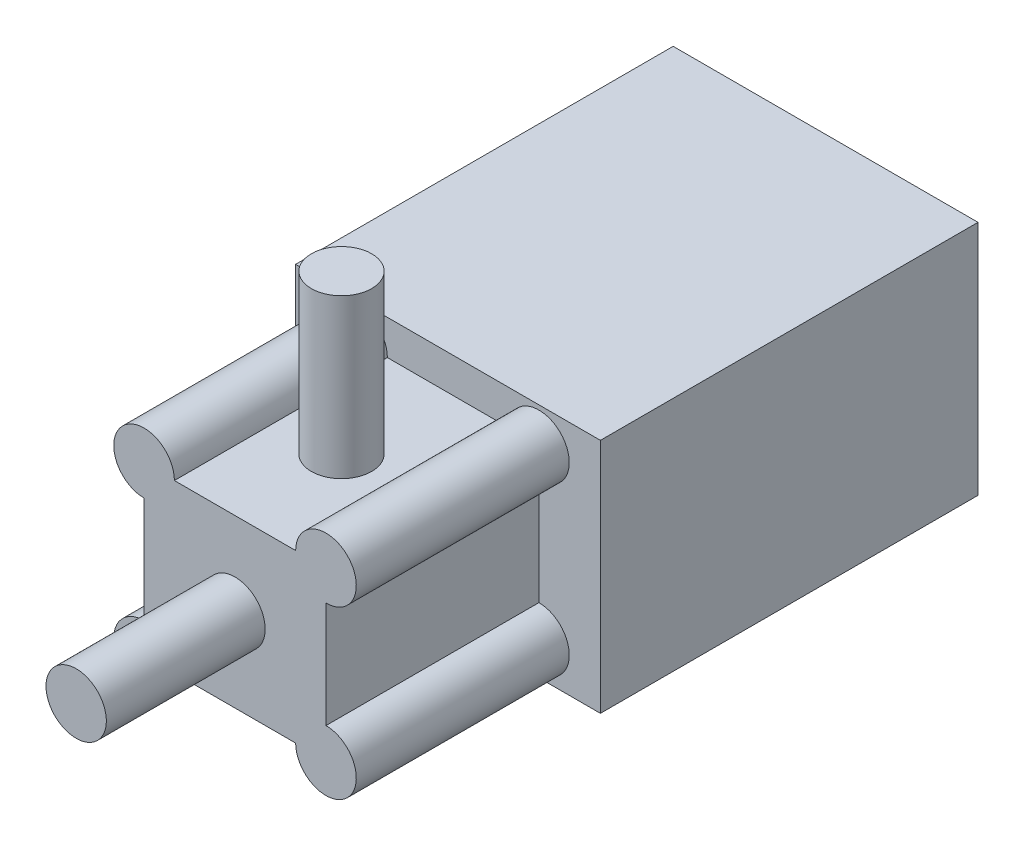
ISO-10303-21;
HEADER;
FILE_DESCRIPTION(('STEP AP214'),'2;1');
FILE_NAME('part.step','',(''),(''),'','','');
FILE_SCHEMA(('AUTOMOTIVE_DESIGN { 1 0 10303 214 1 1 1 1 }'));
ENDSEC;
DATA;
#1=APPLICATION_CONTEXT('core data for automotive mechanical design processes');
#2=APPLICATION_PROTOCOL_DEFINITION('international standard','automotive_design',2000,#1);
#3=PRODUCT_CONTEXT('',#1,'mechanical');
#4=PRODUCT('Part','Part','',(#3));
#5=PRODUCT_RELATED_PRODUCT_CATEGORY('part','',(#4));
#6=PRODUCT_DEFINITION_FORMATION('','',#4);
#7=PRODUCT_DEFINITION_CONTEXT('part definition',#1,'design');
#8=PRODUCT_DEFINITION('design','',#6,#7);
#9=PRODUCT_DEFINITION_SHAPE('','',#8);
#10=(LENGTH_UNIT() NAMED_UNIT(*) SI_UNIT(.MILLI.,.METRE.));
#11=(NAMED_UNIT(*) PLANE_ANGLE_UNIT() SI_UNIT($,.RADIAN.));
#12=(NAMED_UNIT(*) SI_UNIT($,.STERADIAN.) SOLID_ANGLE_UNIT());
#13=UNCERTAINTY_MEASURE_WITH_UNIT(LENGTH_MEASURE(1.E-05),#10,'distance_accuracy_value','');
#14=(GEOMETRIC_REPRESENTATION_CONTEXT(3) GLOBAL_UNCERTAINTY_ASSIGNED_CONTEXT((#13)) GLOBAL_UNIT_ASSIGNED_CONTEXT((#10,
#11,#12)) REPRESENTATION_CONTEXT('',''));
#15=CARTESIAN_POINT('',(0.,0.,0.));
#16=DIRECTION('',(0.,0.,1.));
#17=DIRECTION('',(1.,0.,0.));
#18=AXIS2_PLACEMENT_3D('',#15,#16,#17);
#19=CARTESIAN_POINT('',(-10.055,-7.8,24.91));
#20=DIRECTION('',(1.,0.,0.));
#21=DIRECTION('',(0.,0.,-1.));
#22=AXIS2_PLACEMENT_3D('',#19,#20,#21);
#23=PLANE('',#22);
#24=DIRECTION('',(0.,-1.,0.));
#25=VECTOR('',#24,1.);
#26=CARTESIAN_POINT('',(-10.055,-7.8,0.));
#27=LINE('',#26,#25);
#28=CARTESIAN_POINT('',(-10.055,7.8,0.));
#29=VERTEX_POINT('',#28);
#30=CARTESIAN_POINT('',(-10.055,-7.8,0.));
#31=VERTEX_POINT('',#30);
#32=EDGE_CURVE('E145',#29,#31,#27,.T.);
#33=ORIENTED_EDGE('',*,*,#32,.T.);
#34=DIRECTION('',(0.,0.,-1.));
#35=VECTOR('',#34,1.);
#36=CARTESIAN_POINT('',(-10.055,-7.8,24.91));
#37=LINE('',#36,#35);
#38=CARTESIAN_POINT('',(-10.055,-7.8,24.91));
#39=VERTEX_POINT('',#38);
#40=EDGE_CURVE('E44',#39,#31,#37,.T.);
#41=ORIENTED_EDGE('',*,*,#40,.F.);
#42=DIRECTION('',(0.,-1.,0.));
#43=VECTOR('',#42,1.);
#44=CARTESIAN_POINT('',(-10.055,-7.8,24.91));
#45=LINE('',#44,#43);
#46=CARTESIAN_POINT('',(-10.055,7.8,24.91));
#47=VERTEX_POINT('',#46);
#48=EDGE_CURVE('E154',#47,#39,#45,.T.);
#49=ORIENTED_EDGE('',*,*,#48,.F.);
#50=DIRECTION('',(0.,0.,-1.));
#51=VECTOR('',#50,1.);
#52=CARTESIAN_POINT('',(-10.055,7.8,24.91));
#53=LINE('',#52,#51);
#54=EDGE_CURVE('E163',#47,#29,#53,.T.);
#55=ORIENTED_EDGE('',*,*,#54,.T.);
#56=EDGE_LOOP('',(#33,#41,#49,#55));
#57=FACE_BOUND('',#56,.T.);
#58=ADVANCED_FACE('F37',(#57),#23,.F.);
#59=CARTESIAN_POINT('',(10.055,-7.8,24.91));
#60=DIRECTION('',(0.,1.,0.));
#61=DIRECTION('',(-1.,0.,0.));
#62=AXIS2_PLACEMENT_3D('',#59,#60,#61);
#63=PLANE('',#62);
#64=DIRECTION('',(1.,0.,0.));
#65=VECTOR('',#64,1.);
#66=CARTESIAN_POINT('',(10.055,-7.8,0.));
#67=LINE('',#66,#65);
#68=CARTESIAN_POINT('',(10.055,-7.8,0.));
#69=VERTEX_POINT('',#68);
#70=EDGE_CURVE('E148',#31,#69,#67,.T.);
#71=ORIENTED_EDGE('',*,*,#70,.T.);
#72=DIRECTION('',(0.,0.,-1.));
#73=VECTOR('',#72,1.);
#74=CARTESIAN_POINT('',(10.055,-7.8,24.91));
#75=LINE('',#74,#73);
#76=CARTESIAN_POINT('',(10.055,-7.8,24.91));
#77=VERTEX_POINT('',#76);
#78=EDGE_CURVE('E174',#77,#69,#75,.T.);
#79=ORIENTED_EDGE('',*,*,#78,.F.);
#80=DIRECTION('',(1.,0.,0.));
#81=VECTOR('',#80,1.);
#82=CARTESIAN_POINT('',(10.055,-7.8,24.91));
#83=LINE('',#82,#81);
#84=EDGE_CURVE('E157',#39,#77,#83,.T.);
#85=ORIENTED_EDGE('',*,*,#84,.F.);
#86=ORIENTED_EDGE('',*,*,#40,.T.);
#87=EDGE_LOOP('',(#71,#79,#85,#86));
#88=FACE_BOUND('',#87,.T.);
#89=ADVANCED_FACE('F179',(#88),#63,.F.);
#90=CARTESIAN_POINT('',(10.055,-7.8,24.91));
#91=DIRECTION('',(-1.,0.,0.));
#92=DIRECTION('',(0.,-1.,0.));
#93=AXIS2_PLACEMENT_3D('',#90,#91,#92);
#94=PLANE('',#93);
#95=DIRECTION('',(0.,1.,0.));
#96=VECTOR('',#95,1.);
#97=CARTESIAN_POINT('',(10.055,-7.8,0.));
#98=LINE('',#97,#96);
#99=CARTESIAN_POINT('',(10.055,7.8,0.));
#100=VERTEX_POINT('',#99);
#101=EDGE_CURVE('E166',#69,#100,#98,.T.);
#102=ORIENTED_EDGE('',*,*,#101,.T.);
#103=DIRECTION('',(0.,0.,-1.));
#104=VECTOR('',#103,1.);
#105=CARTESIAN_POINT('',(10.055,7.8,24.91));
#106=LINE('',#105,#104);
#107=CARTESIAN_POINT('',(10.055,7.8,24.91));
#108=VERTEX_POINT('',#107);
#109=EDGE_CURVE('E171',#108,#100,#106,.T.);
#110=ORIENTED_EDGE('',*,*,#109,.F.);
#111=DIRECTION('',(0.,1.,0.));
#112=VECTOR('',#111,1.);
#113=CARTESIAN_POINT('',(10.055,-7.8,24.91));
#114=LINE('',#113,#112);
#115=EDGE_CURVE('E160',#77,#108,#114,.T.);
#116=ORIENTED_EDGE('',*,*,#115,.F.);
#117=ORIENTED_EDGE('',*,*,#78,.T.);
#118=EDGE_LOOP('',(#102,#110,#116,#117));
#119=FACE_BOUND('',#118,.T.);
#120=ADVANCED_FACE('F191',(#119),#94,.F.);
#121=CARTESIAN_POINT('',(10.055,7.8,24.91));
#122=DIRECTION('',(0.,-1.,0.));
#123=DIRECTION('',(1.,0.,0.));
#124=AXIS2_PLACEMENT_3D('',#121,#122,#123);
#125=PLANE('',#124);
#126=DIRECTION('',(-1.,0.,0.));
#127=VECTOR('',#126,1.);
#128=CARTESIAN_POINT('',(10.055,7.8,0.));
#129=LINE('',#128,#127);
#130=EDGE_CURVE('E158',#100,#29,#129,.T.);
#131=ORIENTED_EDGE('',*,*,#130,.T.);
#132=ORIENTED_EDGE('',*,*,#54,.F.);
#133=DIRECTION('',(-1.,0.,0.));
#134=VECTOR('',#133,1.);
#135=CARTESIAN_POINT('',(10.055,7.8,24.91));
#136=LINE('',#135,#134);
#137=EDGE_CURVE('E162',#108,#47,#136,.T.);
#138=ORIENTED_EDGE('',*,*,#137,.F.);
#139=ORIENTED_EDGE('',*,*,#109,.T.);
#140=EDGE_LOOP('',(#131,#132,#138,#139));
#141=FACE_BOUND('',#140,.T.);
#142=ADVANCED_FACE('F195',(#141),#125,.F.);
#143=CARTESIAN_POINT('',(0.,0.,24.91));
#144=DIRECTION('',(0.,0.,1.));
#145=DIRECTION('',(1.,0.,0.));
#146=AXIS2_PLACEMENT_3D('',#143,#144,#145);
#147=PLANE('',#146);
#148=CARTESIAN_POINT('',(6.,-5.5,24.91));
#149=DIRECTION('',(0.,0.,1.));
#150=DIRECTION('',(1.,0.,0.));
#151=AXIS2_PLACEMENT_3D('',#148,#149,#150);
#152=CIRCLE('',#151,2.);
#153=CARTESIAN_POINT('',(4.,-5.5,24.91));
#154=VERTEX_POINT('',#153);
#155=CARTESIAN_POINT('',(6.,-3.5,24.91));
#156=VERTEX_POINT('',#155);
#157=EDGE_CURVE('E51',#154,#156,#152,.T.);
#158=ORIENTED_EDGE('',*,*,#157,.F.);
#159=DIRECTION('',(-1.,0.,0.));
#160=VECTOR('',#159,1.);
#161=CARTESIAN_POINT('',(0.,-5.5,24.91));
#162=LINE('',#161,#160);
#163=CARTESIAN_POINT('',(-4.,-5.5,24.91));
#164=VERTEX_POINT('',#163);
#165=EDGE_CURVE('E56',#154,#164,#162,.T.);
#166=ORIENTED_EDGE('',*,*,#165,.T.);
#167=CARTESIAN_POINT('',(-6.,-5.5,24.91));
#168=DIRECTION('',(0.,0.,1.));
#169=DIRECTION('',(1.,0.,0.));
#170=AXIS2_PLACEMENT_3D('',#167,#168,#169);
#171=CIRCLE('',#170,2.);
#172=CARTESIAN_POINT('',(-6.,-3.5,24.91));
#173=VERTEX_POINT('',#172);
#174=EDGE_CURVE('E398',#173,#164,#171,.T.);
#175=ORIENTED_EDGE('',*,*,#174,.F.);
#176=DIRECTION('',(0.,1.,0.));
#177=VECTOR('',#176,1.);
#178=CARTESIAN_POINT('',(-6.,0.,24.91));
#179=LINE('',#178,#177);
#180=CARTESIAN_POINT('',(-6.,3.5,24.91));
#181=VERTEX_POINT('',#180);
#182=EDGE_CURVE('E396',#173,#181,#179,.T.);
#183=ORIENTED_EDGE('',*,*,#182,.T.);
#184=CARTESIAN_POINT('',(-6.,5.5,24.91));
#185=DIRECTION('',(0.,0.,1.));
#186=DIRECTION('',(1.,0.,0.));
#187=AXIS2_PLACEMENT_3D('',#184,#185,#186);
#188=CIRCLE('',#187,2.);
#189=CARTESIAN_POINT('',(-4.,5.5,24.91));
#190=VERTEX_POINT('',#189);
#191=EDGE_CURVE('E393',#190,#181,#188,.T.);
#192=ORIENTED_EDGE('',*,*,#191,.F.);
#193=DIRECTION('',(-1.,0.,0.));
#194=VECTOR('',#193,1.);
#195=CARTESIAN_POINT('',(0.,5.5,24.91));
#196=LINE('',#195,#194);
#197=CARTESIAN_POINT('',(4.,5.5,24.91));
#198=VERTEX_POINT('',#197);
#199=EDGE_CURVE('E390',#198,#190,#196,.T.);
#200=ORIENTED_EDGE('',*,*,#199,.F.);
#201=CARTESIAN_POINT('',(6.,5.5,24.91));
#202=DIRECTION('',(0.,0.,1.));
#203=DIRECTION('',(1.,0.,0.));
#204=AXIS2_PLACEMENT_3D('',#201,#202,#203);
#205=CIRCLE('',#204,2.);
#206=CARTESIAN_POINT('',(6.,3.5,24.91));
#207=VERTEX_POINT('',#206);
#208=EDGE_CURVE('E387',#207,#198,#205,.T.);
#209=ORIENTED_EDGE('',*,*,#208,.F.);
#210=DIRECTION('',(0.,1.,0.));
#211=VECTOR('',#210,1.);
#212=CARTESIAN_POINT('',(6.,0.,24.91));
#213=LINE('',#212,#211);
#214=EDGE_CURVE('E385',#156,#207,#213,.T.);
#215=ORIENTED_EDGE('',*,*,#214,.F.);
#216=EDGE_LOOP('',(#158,#166,#175,#183,#192,#200,#209,#215));
#217=FACE_BOUND('',#216,.T.);
#218=ORIENTED_EDGE('',*,*,#48,.T.);
#219=ORIENTED_EDGE('',*,*,#84,.T.);
#220=ORIENTED_EDGE('',*,*,#115,.T.);
#221=ORIENTED_EDGE('',*,*,#137,.T.);
#222=EDGE_LOOP('',(#218,#219,#220,#221));
#223=FACE_BOUND('',#222,.T.);
#224=ADVANCED_FACE('F197',(#217,#223),#147,.T.);
#225=CARTESIAN_POINT('',(0.,0.,0.));
#226=DIRECTION('',(0.,0.,1.));
#227=DIRECTION('',(1.,0.,0.));
#228=AXIS2_PLACEMENT_3D('',#225,#226,#227);
#229=PLANE('',#228);
#230=ORIENTED_EDGE('',*,*,#32,.F.);
#231=ORIENTED_EDGE('',*,*,#130,.F.);
#232=ORIENTED_EDGE('',*,*,#101,.F.);
#233=ORIENTED_EDGE('',*,*,#70,.F.);
#234=EDGE_LOOP('',(#230,#231,#232,#233));
#235=FACE_BOUND('',#234,.T.);
#236=ADVANCED_FACE('F187',(#235),#229,.F.);
#237=CARTESIAN_POINT('',(6.,-5.5,38.96));
#238=DIRECTION('',(0.,0.,-1.));
#239=DIRECTION('',(-1.,0.,0.));
#240=AXIS2_PLACEMENT_3D('',#237,#238,#239);
#241=CYLINDRICAL_SURFACE('',#240,2.);
#242=ORIENTED_EDGE('',*,*,#157,.T.);
#243=DIRECTION('',(0.,0.,-1.));
#244=VECTOR('',#243,1.);
#245=CARTESIAN_POINT('',(6.,-3.5,38.96));
#246=LINE('',#245,#244);
#247=CARTESIAN_POINT('',(6.,-3.5,38.96));
#248=VERTEX_POINT('',#247);
#249=EDGE_CURVE('E129',#248,#156,#246,.T.);
#250=ORIENTED_EDGE('',*,*,#249,.F.);
#251=CARTESIAN_POINT('',(6.,-5.5,38.96));
#252=DIRECTION('',(0.,0.,1.));
#253=DIRECTION('',(1.,0.,0.));
#254=AXIS2_PLACEMENT_3D('',#251,#252,#253);
#255=CIRCLE('',#254,2.);
#256=CARTESIAN_POINT('',(4.,-5.5,38.96));
#257=VERTEX_POINT('',#256);
#258=EDGE_CURVE('E135',#257,#248,#255,.T.);
#259=ORIENTED_EDGE('',*,*,#258,.F.);
#260=DIRECTION('',(0.,0.,-1.));
#261=VECTOR('',#260,1.);
#262=CARTESIAN_POINT('',(4.,-5.5,38.96));
#263=LINE('',#262,#261);
#264=EDGE_CURVE('E383',#257,#154,#263,.T.);
#265=ORIENTED_EDGE('',*,*,#264,.T.);
#266=EDGE_LOOP('',(#242,#250,#259,#265));
#267=FACE_BOUND('',#266,.T.);
#268=ADVANCED_FACE('F144',(#267),#241,.T.);
#269=CARTESIAN_POINT('',(6.,0.,38.96));
#270=DIRECTION('',(-1.,0.,0.));
#271=DIRECTION('',(0.,0.,1.));
#272=AXIS2_PLACEMENT_3D('',#269,#270,#271);
#273=PLANE('',#272);
#274=ORIENTED_EDGE('',*,*,#214,.T.);
#275=DIRECTION('',(0.,0.,-1.));
#276=VECTOR('',#275,1.);
#277=CARTESIAN_POINT('',(6.,3.5,38.96));
#278=LINE('',#277,#276);
#279=CARTESIAN_POINT('',(6.,3.5,38.96));
#280=VERTEX_POINT('',#279);
#281=EDGE_CURVE('E131',#280,#207,#278,.T.);
#282=ORIENTED_EDGE('',*,*,#281,.F.);
#283=DIRECTION('',(0.,1.,0.));
#284=VECTOR('',#283,1.);
#285=CARTESIAN_POINT('',(6.,0.,38.96));
#286=LINE('',#285,#284);
#287=EDGE_CURVE('E124',#248,#280,#286,.T.);
#288=ORIENTED_EDGE('',*,*,#287,.F.);
#289=ORIENTED_EDGE('',*,*,#249,.T.);
#290=EDGE_LOOP('',(#274,#282,#288,#289));
#291=FACE_BOUND('',#290,.T.);
#292=ADVANCED_FACE('F127',(#291),#273,.F.);
#293=CARTESIAN_POINT('',(6.,5.5,38.96));
#294=DIRECTION('',(0.,0.,-1.));
#295=DIRECTION('',(-1.,0.,0.));
#296=AXIS2_PLACEMENT_3D('',#293,#294,#295);
#297=CYLINDRICAL_SURFACE('',#296,2.);
#298=ORIENTED_EDGE('',*,*,#208,.T.);
#299=DIRECTION('',(0.,0.,-1.));
#300=VECTOR('',#299,1.);
#301=CARTESIAN_POINT('',(4.,5.5,38.96));
#302=LINE('',#301,#300);
#303=CARTESIAN_POINT('',(4.,5.5,38.96));
#304=VERTEX_POINT('',#303);
#305=EDGE_CURVE('E150',#304,#198,#302,.T.);
#306=ORIENTED_EDGE('',*,*,#305,.F.);
#307=CARTESIAN_POINT('',(6.,5.5,38.96));
#308=DIRECTION('',(0.,0.,1.));
#309=DIRECTION('',(1.,0.,0.));
#310=AXIS2_PLACEMENT_3D('',#307,#308,#309);
#311=CIRCLE('',#310,2.);
#312=EDGE_CURVE('E134',#280,#304,#311,.T.);
#313=ORIENTED_EDGE('',*,*,#312,.F.);
#314=ORIENTED_EDGE('',*,*,#281,.T.);
#315=EDGE_LOOP('',(#298,#306,#313,#314));
#316=FACE_BOUND('',#315,.T.);
#317=ADVANCED_FACE('F247',(#316),#297,.T.);
#318=CARTESIAN_POINT('',(0.,5.5,38.96));
#319=DIRECTION('',(0.,-1.,0.));
#320=DIRECTION('',(1.,0.,0.));
#321=AXIS2_PLACEMENT_3D('',#318,#319,#320);
#322=PLANE('',#321);
#323=CARTESIAN_POINT('',(0.,5.5,31.935));
#324=DIRECTION('',(0.,-1.,0.));
#325=DIRECTION('',(1.,0.,0.));
#326=AXIS2_PLACEMENT_3D('',#323,#324,#325);
#327=CIRCLE('',#326,1.99);
#328=CARTESIAN_POINT('',(1.99,5.5,31.935));
#329=VERTEX_POINT('',#328);
#330=EDGE_CURVE('E11',#329,#329,#327,.F.);
#331=ORIENTED_EDGE('',*,*,#330,.F.);
#332=EDGE_LOOP('',(#331));
#333=FACE_BOUND('',#332,.T.);
#334=ORIENTED_EDGE('',*,*,#199,.T.);
#335=DIRECTION('',(0.,0.,-1.));
#336=VECTOR('',#335,1.);
#337=CARTESIAN_POINT('',(-4.,5.5,38.96));
#338=LINE('',#337,#336);
#339=CARTESIAN_POINT('',(-4.,5.5,38.96));
#340=VERTEX_POINT('',#339);
#341=EDGE_CURVE('E411',#340,#190,#338,.T.);
#342=ORIENTED_EDGE('',*,*,#341,.F.);
#343=DIRECTION('',(-1.,0.,0.));
#344=VECTOR('',#343,1.);
#345=CARTESIAN_POINT('',(0.,5.5,38.96));
#346=LINE('',#345,#344);
#347=EDGE_CURVE('E373',#304,#340,#346,.T.);
#348=ORIENTED_EDGE('',*,*,#347,.F.);
#349=ORIENTED_EDGE('',*,*,#305,.T.);
#350=EDGE_LOOP('',(#334,#342,#348,#349));
#351=FACE_BOUND('',#350,.T.);
#352=ADVANCED_FACE('F256',(#333,#351),#322,.F.);
#353=CARTESIAN_POINT('',(-6.,5.5,38.96));
#354=DIRECTION('',(0.,0.,-1.));
#355=DIRECTION('',(-1.,0.,0.));
#356=AXIS2_PLACEMENT_3D('',#353,#354,#355);
#357=CYLINDRICAL_SURFACE('',#356,2.);
#358=ORIENTED_EDGE('',*,*,#191,.T.);
#359=DIRECTION('',(0.,0.,-1.));
#360=VECTOR('',#359,1.);
#361=CARTESIAN_POINT('',(-6.,3.5,38.96));
#362=LINE('',#361,#360);
#363=CARTESIAN_POINT('',(-6.,3.5,38.96));
#364=VERTEX_POINT('',#363);
#365=EDGE_CURVE('E408',#364,#181,#362,.T.);
#366=ORIENTED_EDGE('',*,*,#365,.F.);
#367=CARTESIAN_POINT('',(-6.,5.5,38.96));
#368=DIRECTION('',(0.,0.,1.));
#369=DIRECTION('',(1.,0.,0.));
#370=AXIS2_PLACEMENT_3D('',#367,#368,#369);
#371=CIRCLE('',#370,2.);
#372=EDGE_CURVE('E375',#340,#364,#371,.T.);
#373=ORIENTED_EDGE('',*,*,#372,.F.);
#374=ORIENTED_EDGE('',*,*,#341,.T.);
#375=EDGE_LOOP('',(#358,#366,#373,#374));
#376=FACE_BOUND('',#375,.T.);
#377=ADVANCED_FACE('F264',(#376),#357,.T.);
#378=CARTESIAN_POINT('',(-6.,0.,38.96));
#379=DIRECTION('',(-1.,0.,0.));
#380=DIRECTION('',(0.,0.,1.));
#381=AXIS2_PLACEMENT_3D('',#378,#379,#380);
#382=PLANE('',#381);
#383=ORIENTED_EDGE('',*,*,#182,.F.);
#384=DIRECTION('',(0.,0.,-1.));
#385=VECTOR('',#384,1.);
#386=CARTESIAN_POINT('',(-6.,-3.5,38.96));
#387=LINE('',#386,#385);
#388=CARTESIAN_POINT('',(-6.,-3.5,38.96));
#389=VERTEX_POINT('',#388);
#390=EDGE_CURVE('E405',#389,#173,#387,.T.);
#391=ORIENTED_EDGE('',*,*,#390,.F.);
#392=DIRECTION('',(0.,1.,0.));
#393=VECTOR('',#392,1.);
#394=CARTESIAN_POINT('',(-6.,0.,38.96));
#395=LINE('',#394,#393);
#396=EDGE_CURVE('E377',#389,#364,#395,.T.);
#397=ORIENTED_EDGE('',*,*,#396,.T.);
#398=ORIENTED_EDGE('',*,*,#365,.T.);
#399=EDGE_LOOP('',(#383,#391,#397,#398));
#400=FACE_BOUND('',#399,.T.);
#401=ADVANCED_FACE('F269',(#400),#382,.T.);
#402=CARTESIAN_POINT('',(-6.,-5.5,38.96));
#403=DIRECTION('',(0.,0.,-1.));
#404=DIRECTION('',(-1.,0.,0.));
#405=AXIS2_PLACEMENT_3D('',#402,#403,#404);
#406=CYLINDRICAL_SURFACE('',#405,2.);
#407=ORIENTED_EDGE('',*,*,#174,.T.);
#408=DIRECTION('',(0.,0.,-1.));
#409=VECTOR('',#408,1.);
#410=CARTESIAN_POINT('',(-4.,-5.5,38.96));
#411=LINE('',#410,#409);
#412=CARTESIAN_POINT('',(-4.,-5.5,38.96));
#413=VERTEX_POINT('',#412);
#414=EDGE_CURVE('E403',#413,#164,#411,.T.);
#415=ORIENTED_EDGE('',*,*,#414,.F.);
#416=CARTESIAN_POINT('',(-6.,-5.5,38.96));
#417=DIRECTION('',(0.,0.,1.));
#418=DIRECTION('',(1.,0.,0.));
#419=AXIS2_PLACEMENT_3D('',#416,#417,#418);
#420=CIRCLE('',#419,2.);
#421=EDGE_CURVE('E380',#389,#413,#420,.T.);
#422=ORIENTED_EDGE('',*,*,#421,.F.);
#423=ORIENTED_EDGE('',*,*,#390,.T.);
#424=EDGE_LOOP('',(#407,#415,#422,#423));
#425=FACE_BOUND('',#424,.T.);
#426=ADVANCED_FACE('F279',(#425),#406,.T.);
#427=CARTESIAN_POINT('',(0.,-5.5,38.96));
#428=DIRECTION('',(0.,-1.,0.));
#429=DIRECTION('',(1.,0.,0.));
#430=AXIS2_PLACEMENT_3D('',#427,#428,#429);
#431=PLANE('',#430);
#432=ORIENTED_EDGE('',*,*,#165,.F.);
#433=ORIENTED_EDGE('',*,*,#264,.F.);
#434=DIRECTION('',(-1.,0.,0.));
#435=VECTOR('',#434,1.);
#436=CARTESIAN_POINT('',(0.,-5.5,38.96));
#437=LINE('',#436,#435);
#438=EDGE_CURVE('E141',#257,#413,#437,.T.);
#439=ORIENTED_EDGE('',*,*,#438,.T.);
#440=ORIENTED_EDGE('',*,*,#414,.T.);
#441=EDGE_LOOP('',(#432,#433,#439,#440));
#442=FACE_BOUND('',#441,.T.);
#443=ADVANCED_FACE('F289',(#442),#431,.T.);
#444=CARTESIAN_POINT('',(0.,0.,38.96));
#445=DIRECTION('',(0.,0.,1.));
#446=DIRECTION('',(1.,0.,0.));
#447=AXIS2_PLACEMENT_3D('',#444,#445,#446);
#448=PLANE('',#447);
#449=CARTESIAN_POINT('',(0.,0.,38.96));
#450=DIRECTION('',(0.,0.,1.));
#451=DIRECTION('',(1.,0.,0.));
#452=AXIS2_PLACEMENT_3D('',#449,#450,#451);
#453=CIRCLE('',#452,1.99);
#454=CARTESIAN_POINT('',(-1.99,0.,38.96));
#455=VERTEX_POINT('',#454);
#456=EDGE_CURVE('E365',#455,#455,#453,.T.);
#457=ORIENTED_EDGE('',*,*,#456,.F.);
#458=EDGE_LOOP('',(#457));
#459=FACE_BOUND('',#458,.T.);
#460=ORIENTED_EDGE('',*,*,#258,.T.);
#461=ORIENTED_EDGE('',*,*,#287,.T.);
#462=ORIENTED_EDGE('',*,*,#312,.T.);
#463=ORIENTED_EDGE('',*,*,#347,.T.);
#464=ORIENTED_EDGE('',*,*,#372,.T.);
#465=ORIENTED_EDGE('',*,*,#396,.F.);
#466=ORIENTED_EDGE('',*,*,#421,.T.);
#467=ORIENTED_EDGE('',*,*,#438,.F.);
#468=EDGE_LOOP('',(#460,#461,#462,#463,#464,#465,#466,#467));
#469=FACE_BOUND('',#468,.T.);
#470=ADVANCED_FACE('F139',(#459,#469),#448,.T.);
#471=CARTESIAN_POINT('',(0.,15.95,31.935));
#472=DIRECTION('',(0.,-1.,0.));
#473=DIRECTION('',(1.,0.,0.));
#474=AXIS2_PLACEMENT_3D('',#471,#472,#473);
#475=CYLINDRICAL_SURFACE('',#474,1.99);
#476=CARTESIAN_POINT('',(0.,15.95,31.935));
#477=DIRECTION('',(0.,1.,0.));
#478=DIRECTION('',(-1.,0.,0.));
#479=AXIS2_PLACEMENT_3D('',#476,#477,#478);
#480=CIRCLE('',#479,1.99);
#481=CARTESIAN_POINT('',(-1.99,15.95,31.935));
#482=VERTEX_POINT('',#481);
#483=EDGE_CURVE('E364',#482,#482,#480,.T.);
#484=ORIENTED_EDGE('',*,*,#483,.F.);
#485=EDGE_LOOP('',(#484));
#486=FACE_BOUND('',#485,.T.);
#487=ORIENTED_EDGE('',*,*,#330,.T.);
#488=EDGE_LOOP('',(#487));
#489=FACE_BOUND('',#488,.T.);
#490=ADVANCED_FACE('F313',(#486,#489),#475,.T.);
#491=CARTESIAN_POINT('',(0.,15.95,31.935));
#492=DIRECTION('',(0.,1.,0.));
#493=DIRECTION('',(-1.,0.,0.));
#494=AXIS2_PLACEMENT_3D('',#491,#492,#493);
#495=PLANE('',#494);
#496=ORIENTED_EDGE('',*,*,#483,.T.);
#497=EDGE_LOOP('',(#496));
#498=FACE_BOUND('',#497,.T.);
#499=ADVANCED_FACE('F318',(#498),#495,.T.);
#500=CARTESIAN_POINT('',(0.,0.,49.44));
#501=DIRECTION('',(0.,0.,-1.));
#502=DIRECTION('',(-1.,0.,0.));
#503=AXIS2_PLACEMENT_3D('',#500,#501,#502);
#504=CYLINDRICAL_SURFACE('',#503,1.99);
#505=CARTESIAN_POINT('',(0.,0.,49.44));
#506=DIRECTION('',(0.,0.,1.));
#507=DIRECTION('',(1.,0.,0.));
#508=AXIS2_PLACEMENT_3D('',#505,#506,#507);
#509=CIRCLE('',#508,1.99);
#510=CARTESIAN_POINT('',(-1.99,0.,49.44));
#511=VERTEX_POINT('',#510);
#512=EDGE_CURVE('E363',#511,#511,#509,.T.);
#513=CARTESIAN_POINT('',(-1.99,0.,49.44));
#514=CARTESIAN_POINT('',(-1.99,0.,49.3308333333333));
#515=CARTESIAN_POINT('',(-1.99,0.,49.2216666666667));
#516=CARTESIAN_POINT('',(-1.99,0.,49.0033333333333));
#517=CARTESIAN_POINT('',(-1.99,0.,48.8941666666667));
#518=CARTESIAN_POINT('',(-1.99,0.,48.6758333333333));
#519=CARTESIAN_POINT('',(-1.99,0.,48.5666666666667));
#520=CARTESIAN_POINT('',(-1.99,0.,48.3483333333333));
#521=CARTESIAN_POINT('',(-1.99,0.,48.2391666666667));
#522=CARTESIAN_POINT('',(-1.99,0.,48.0208333333333));
#523=CARTESIAN_POINT('',(-1.99,0.,47.9116666666667));
#524=CARTESIAN_POINT('',(-1.99,0.,47.6933333333333));
#525=CARTESIAN_POINT('',(-1.99,0.,47.5841666666667));
#526=CARTESIAN_POINT('',(-1.99,0.,47.3658333333333));
#527=CARTESIAN_POINT('',(-1.99,0.,47.2566666666667));
#528=CARTESIAN_POINT('',(-1.99,0.,47.0383333333333));
#529=CARTESIAN_POINT('',(-1.99,0.,46.9291666666667));
#530=CARTESIAN_POINT('',(-1.99,0.,46.7108333333333));
#531=CARTESIAN_POINT('',(-1.99,0.,46.6016666666667));
#532=CARTESIAN_POINT('',(-1.99,0.,46.3833333333333));
#533=CARTESIAN_POINT('',(-1.99,0.,46.2741666666667));
#534=CARTESIAN_POINT('',(-1.99,0.,46.0558333333333));
#535=CARTESIAN_POINT('',(-1.99,0.,45.9466666666667));
#536=CARTESIAN_POINT('',(-1.99,0.,45.7283333333333));
#537=CARTESIAN_POINT('',(-1.99,0.,45.6191666666667));
#538=CARTESIAN_POINT('',(-1.99,0.,45.4008333333333));
#539=CARTESIAN_POINT('',(-1.99,0.,45.2916666666667));
#540=CARTESIAN_POINT('',(-1.99,0.,45.0733333333333));
#541=CARTESIAN_POINT('',(-1.99,0.,44.9641666666667));
#542=CARTESIAN_POINT('',(-1.99,0.,44.7458333333333));
#543=CARTESIAN_POINT('',(-1.99,0.,44.6366666666667));
#544=CARTESIAN_POINT('',(-1.99,0.,44.4183333333333));
#545=CARTESIAN_POINT('',(-1.99,0.,44.3091666666667));
#546=CARTESIAN_POINT('',(-1.99,0.,44.0908333333333));
#547=CARTESIAN_POINT('',(-1.99,0.,43.9816666666667));
#548=CARTESIAN_POINT('',(-1.99,0.,43.7633333333333));
#549=CARTESIAN_POINT('',(-1.99,0.,43.6541666666667));
#550=CARTESIAN_POINT('',(-1.99,0.,43.4358333333333));
#551=CARTESIAN_POINT('',(-1.99,0.,43.3266666666667));
#552=CARTESIAN_POINT('',(-1.99,0.,43.1083333333333));
#553=CARTESIAN_POINT('',(-1.99,0.,42.9991666666667));
#554=CARTESIAN_POINT('',(-1.99,0.,42.7808333333333));
#555=CARTESIAN_POINT('',(-1.99,0.,42.6716666666667));
#556=CARTESIAN_POINT('',(-1.99,0.,42.4533333333333));
#557=CARTESIAN_POINT('',(-1.99,0.,42.3441666666667));
#558=CARTESIAN_POINT('',(-1.99,0.,42.1258333333333));
#559=CARTESIAN_POINT('',(-1.99,0.,42.0166666666667));
#560=CARTESIAN_POINT('',(-1.99,0.,41.7983333333333));
#561=CARTESIAN_POINT('',(-1.99,0.,41.6891666666667));
#562=CARTESIAN_POINT('',(-1.99,0.,41.4708333333333));
#563=CARTESIAN_POINT('',(-1.99,0.,41.3616666666667));
#564=CARTESIAN_POINT('',(-1.99,0.,41.1433333333333));
#565=CARTESIAN_POINT('',(-1.99,0.,41.0341666666667));
#566=CARTESIAN_POINT('',(-1.99,0.,40.8158333333333));
#567=CARTESIAN_POINT('',(-1.99,0.,40.7066666666667));
#568=CARTESIAN_POINT('',(-1.99,0.,40.4883333333333));
#569=CARTESIAN_POINT('',(-1.99,0.,40.3791666666667));
#570=CARTESIAN_POINT('',(-1.99,0.,40.1608333333333));
#571=CARTESIAN_POINT('',(-1.99,0.,40.0516666666667));
#572=CARTESIAN_POINT('',(-1.99,0.,39.8333333333333));
#573=CARTESIAN_POINT('',(-1.99,0.,39.7241666666667));
#574=CARTESIAN_POINT('',(-1.99,0.,39.5058333333333));
#575=CARTESIAN_POINT('',(-1.99,0.,39.3966666666667));
#576=CARTESIAN_POINT('',(-1.99,0.,39.1783333333333));
#577=CARTESIAN_POINT('',(-1.99,0.,39.0691666666667));
#578=CARTESIAN_POINT('',(-1.99,0.,38.96));
#579=B_SPLINE_CURVE_WITH_KNOTS('',3,(#513,#514,#515,#516,#517,#518,#519,#520,#521,#522,#523,
#524,#525,#526,#527,#528,#529,#530,#531,#532,#533,#534,#535,#536,#537,#538,#539,#540,#541,#542,
#543,#544,#545,#546,#547,#548,#549,#550,#551,#552,#553,#554,#555,#556,#557,#558,#559,#560,#561,
#562,#563,#564,#565,#566,#567,#568,#569,#570,#571,#572,#573,#574,#575,#576,#577,#578),
.UNSPECIFIED.,.F.,.F.,(4,2,2,2,2,2,2,2,2,2,2,2,2,2,2,2,2,2,2,2,2,2,2,2,2,2,2,2,2,2,2,2,4),(0.,
0.327500000000001,0.655000000000003,0.982500000000004,1.31000000000001,1.6375,1.965,2.2925,2.62,
2.9475,3.275,3.6025,3.93,4.2575,4.585,4.9125,5.24,5.5675,5.895,6.2225,6.55,6.8775,7.205,7.5325,
7.86,8.1875,8.515,8.8425,9.17,9.4975,9.825,10.1525,10.48),.UNSPECIFIED.);
#580=EDGE_CURVE('BSEAM329',#511,#455,#579,.T.);
#581=ORIENTED_EDGE('',*,*,#512,.F.);
#582=ORIENTED_EDGE('',*,*,#456,.T.);
#583=ORIENTED_EDGE('',*,*,#580,.T.);
#584=ORIENTED_EDGE('',*,*,#580,.F.);
#585=EDGE_LOOP('',(#581,#583,#582,#584));
#586=FACE_BOUND('',#585,.T.);
#587=ADVANCED_FACE('F329',(#586),#504,.T.);
#588=CARTESIAN_POINT('',(0.,0.,49.44));
#589=DIRECTION('',(0.,0.,1.));
#590=DIRECTION('',(1.,0.,0.));
#591=AXIS2_PLACEMENT_3D('',#588,#589,#590);
#592=PLANE('',#591);
#593=ORIENTED_EDGE('',*,*,#512,.T.);
#594=EDGE_LOOP('',(#593));
#595=FACE_BOUND('',#594,.T.);
#596=ADVANCED_FACE('F347',(#595),#592,.T.);
#597=CLOSED_SHELL('',(#58,#89,#120,#142,#224,#236,#268,#292,#317,#352,#377,#401,#426,#443,#470,
#490,#499,#587,#596));
#598=MANIFOLD_SOLID_BREP('B2',#597);
#599=ADVANCED_BREP_SHAPE_REPRESENTATION('',(#18,#598),#14);
#600=SHAPE_DEFINITION_REPRESENTATION(#9,#599);
ENDSEC;
END-ISO-10303-21;
